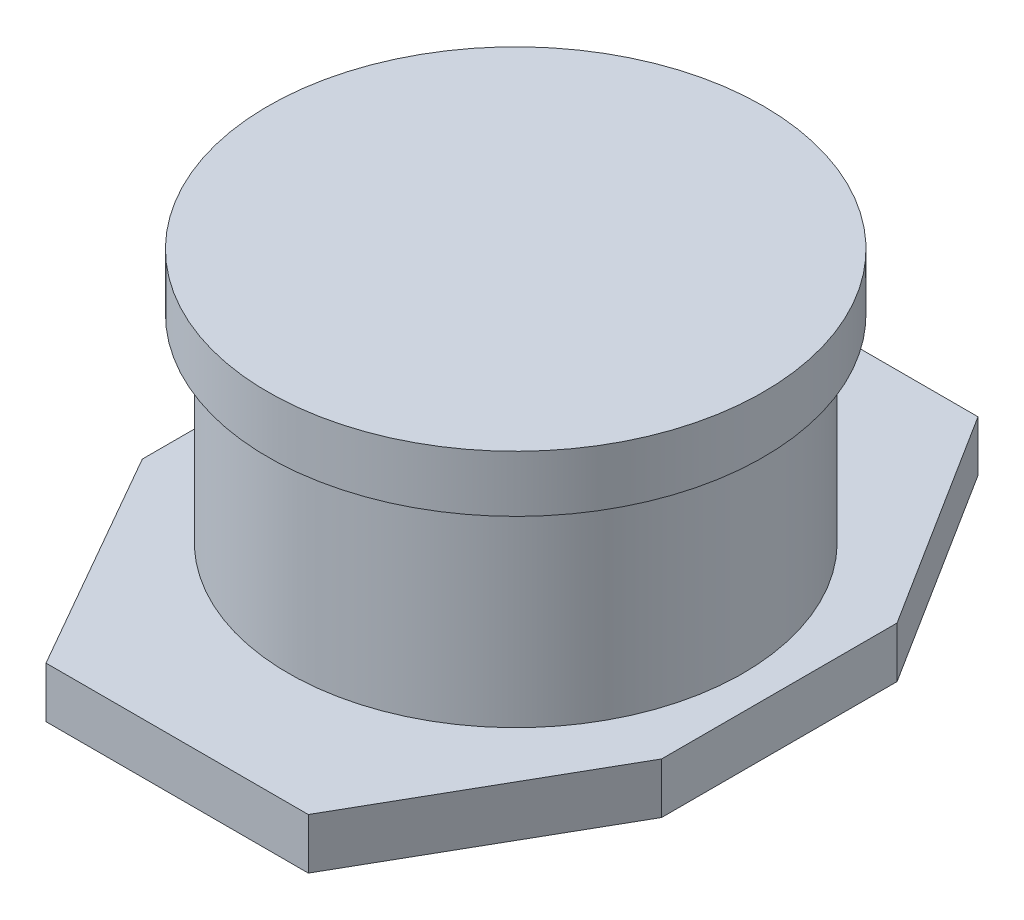
ISO-10303-21;
HEADER;
FILE_DESCRIPTION(('STEP AP214'),'2;1');
FILE_NAME('part.step','',(''),(''),'','','');
FILE_SCHEMA(('AUTOMOTIVE_DESIGN { 1 0 10303 214 1 1 1 1 }'));
ENDSEC;
DATA;
#1=APPLICATION_CONTEXT('core data for automotive mechanical design processes');
#2=APPLICATION_PROTOCOL_DEFINITION('international standard','automotive_design',2000,#1);
#3=PRODUCT_CONTEXT('',#1,'mechanical');
#4=PRODUCT('Part','Part','',(#3));
#5=PRODUCT_RELATED_PRODUCT_CATEGORY('part','',(#4));
#6=PRODUCT_DEFINITION_FORMATION('','',#4);
#7=PRODUCT_DEFINITION_CONTEXT('part definition',#1,'design');
#8=PRODUCT_DEFINITION('design','',#6,#7);
#9=PRODUCT_DEFINITION_SHAPE('','',#8);
#10=(LENGTH_UNIT() NAMED_UNIT(*) SI_UNIT(.MILLI.,.METRE.));
#11=(NAMED_UNIT(*) PLANE_ANGLE_UNIT() SI_UNIT($,.RADIAN.));
#12=(NAMED_UNIT(*) SI_UNIT($,.STERADIAN.) SOLID_ANGLE_UNIT());
#13=UNCERTAINTY_MEASURE_WITH_UNIT(LENGTH_MEASURE(1.E-05),#10,'distance_accuracy_value','');
#14=(GEOMETRIC_REPRESENTATION_CONTEXT(3) GLOBAL_UNCERTAINTY_ASSIGNED_CONTEXT((#13)) GLOBAL_UNIT_ASSIGNED_CONTEXT((#10,
#11,#12)) REPRESENTATION_CONTEXT('',''));
#15=CARTESIAN_POINT('',(0.,0.,0.));
#16=DIRECTION('',(0.,0.,1.));
#17=DIRECTION('',(1.,0.,0.));
#18=AXIS2_PLACEMENT_3D('',#15,#16,#17);
#19=CARTESIAN_POINT('',(-2.30220000927827,5.4,0.522935680184341));
#20=DIRECTION('',(0.,1.,0.));
#21=DIRECTION('',(0.,0.,1.));
#22=AXIS2_PLACEMENT_3D('',#19,#20,#21);
#23=PLANE('',#22);
#24=CARTESIAN_POINT('',(-0.019136169197603,5.4,0.522935680184341));
#25=DIRECTION('',(0.,-1.,0.));
#26=DIRECTION('',(0.,0.,-1.));
#27=AXIS2_PLACEMENT_3D('',#24,#25,#26);
#28=CIRCLE('',#27,4.39253848223317);
#29=CARTESIAN_POINT('',(-0.019136169197603,5.4,-3.86960280204883));
#30=VERTEX_POINT('',#29);
#31=EDGE_CURVE('E20',#30,#30,#28,.T.);
#32=ORIENTED_EDGE('',*,*,#31,.F.);
#33=EDGE_LOOP('',(#32));
#34=FACE_BOUND('',#33,.T.);
#35=ADVANCED_FACE('F17',(#34),#23,.T.);
#36=CARTESIAN_POINT('',(-0.019136169197603,5.4,0.522935680184341));
#37=DIRECTION('',(0.,-1.,0.));
#38=DIRECTION('',(0.,0.,-1.));
#39=AXIS2_PLACEMENT_3D('',#36,#37,#38);
#40=CYLINDRICAL_SURFACE('',#39,4.39253848223317);
#41=CARTESIAN_POINT('',(-0.019136169197603,4.4,0.522935680184341));
#42=DIRECTION('',(0.,-1.,0.));
#43=DIRECTION('',(0.,0.,-1.));
#44=AXIS2_PLACEMENT_3D('',#41,#42,#43);
#45=CIRCLE('',#44,4.39253848223317);
#46=CARTESIAN_POINT('',(-0.019136169197603,4.4,-3.86960280204883));
#47=VERTEX_POINT('',#46);
#48=EDGE_CURVE('E110',#47,#47,#45,.F.);
#49=ORIENTED_EDGE('',*,*,#48,.T.);
#50=EDGE_LOOP('',(#49));
#51=FACE_BOUND('',#50,.T.);
#52=ORIENTED_EDGE('',*,*,#31,.T.);
#53=EDGE_LOOP('',(#52));
#54=FACE_BOUND('',#53,.T.);
#55=ADVANCED_FACE('F117',(#51,#54),#40,.T.);
#56=CARTESIAN_POINT('',(-0.0191361691976033,4.4,0.522935680184341));
#57=DIRECTION('',(0.,1.,0.));
#58=DIRECTION('',(0.,0.,1.));
#59=AXIS2_PLACEMENT_3D('',#56,#57,#58);
#60=PLANE('',#59);
#61=CARTESIAN_POINT('',(-0.0191361691976022,4.4,0.522935680184341));
#62=DIRECTION('',(0.,-1.,0.));
#63=DIRECTION('',(0.,0.,-1.));
#64=AXIS2_PLACEMENT_3D('',#61,#62,#63);
#65=CIRCLE('',#64,4.03112893421778);
#66=CARTESIAN_POINT('',(-0.0191361691976022,4.4,-3.50819325403344));
#67=VERTEX_POINT('',#66);
#68=EDGE_CURVE('E108',#67,#67,#65,.T.);
#69=ORIENTED_EDGE('',*,*,#68,.F.);
#70=EDGE_LOOP('',(#69));
#71=FACE_BOUND('',#70,.T.);
#72=ORIENTED_EDGE('',*,*,#48,.F.);
#73=EDGE_LOOP('',(#72));
#74=FACE_BOUND('',#73,.T.);
#75=ADVANCED_FACE('F124',(#71,#74),#60,.F.);
#76=CARTESIAN_POINT('',(-0.0191361691976022,4.4,0.522935680184341));
#77=DIRECTION('',(0.,-1.,0.));
#78=DIRECTION('',(0.,0.,-1.));
#79=AXIS2_PLACEMENT_3D('',#76,#77,#78);
#80=CYLINDRICAL_SURFACE('',#79,4.03112893421778);
#81=CARTESIAN_POINT('',(-0.0191361691976022,0.9,0.522935680184341));
#82=DIRECTION('',(0.,-1.,0.));
#83=DIRECTION('',(0.,0.,-1.));
#84=AXIS2_PLACEMENT_3D('',#81,#82,#83);
#85=CIRCLE('',#84,4.03112893421778);
#86=CARTESIAN_POINT('',(-0.0191361691976022,0.9,-3.50819325403344));
#87=VERTEX_POINT('',#86);
#88=EDGE_CURVE('E91',#87,#87,#85,.T.);
#89=ORIENTED_EDGE('',*,*,#88,.F.);
#90=EDGE_LOOP('',(#89));
#91=FACE_BOUND('',#90,.T.);
#92=ORIENTED_EDGE('',*,*,#68,.T.);
#93=EDGE_LOOP('',(#92));
#94=FACE_BOUND('',#93,.T.);
#95=ADVANCED_FACE('F162',(#91,#94),#80,.T.);
#96=CARTESIAN_POINT('',(0.,0.9,0.522935680184341));
#97=DIRECTION('',(0.,1.,0.));
#98=DIRECTION('',(0.,0.,1.));
#99=AXIS2_PLACEMENT_3D('',#96,#97,#98);
#100=PLANE('',#99);
#101=ORIENTED_EDGE('',*,*,#88,.T.);
#102=EDGE_LOOP('',(#101));
#103=FACE_BOUND('',#102,.T.);
#104=DIRECTION('',(-0.496276882885727,0.,0.868164302141724));
#105=VECTOR('',#104,1.);
#106=CARTESIAN_POINT('',(4.60440001855655,0.9,2.5593405117462));
#107=LINE('',#106,#105);
#108=CARTESIAN_POINT('',(2.32554204331554,0.9,6.54587144232507));
#109=VERTEX_POINT('',#108);
#110=CARTESIAN_POINT('',(4.60440001855655,0.9,2.5593405117462));
#111=VERTEX_POINT('',#110);
#112=EDGE_CURVE('E82',#109,#111,#107,.F.);
#113=ORIENTED_EDGE('',*,*,#112,.T.);
#114=DIRECTION('',(0.,0.,1.));
#115=VECTOR('',#114,1.);
#116=CARTESIAN_POINT('',(4.60440001855655,0.9,-1.61582712654262));
#117=LINE('',#116,#115);
#118=CARTESIAN_POINT('',(4.60440001855655,0.9,-1.61582712654262));
#119=VERTEX_POINT('',#118);
#120=EDGE_CURVE('E79',#111,#119,#117,.F.);
#121=ORIENTED_EDGE('',*,*,#120,.T.);
#122=DIRECTION('',(0.533383785827167,0.,0.845873357552228));
#123=VECTOR('',#122,1.);
#124=CARTESIAN_POINT('',(2.15515054489858,0.9,-5.50000008195639));
#125=LINE('',#124,#123);
#126=CARTESIAN_POINT('',(2.15515054489858,0.9,-5.50000008195639));
#127=VERTEX_POINT('',#126);
#128=EDGE_CURVE('E293',#119,#127,#125,.F.);
#129=ORIENTED_EDGE('',*,*,#128,.T.);
#130=DIRECTION('',(-1.,0.,0.));
#131=VECTOR('',#130,1.);
#132=CARTESIAN_POINT('',(0.,0.9,-5.50000008195639));
#133=LINE('',#132,#131);
#134=CARTESIAN_POINT('',(-2.15515054489857,0.9,-5.50000008195639));
#135=VERTEX_POINT('',#134);
#136=EDGE_CURVE('E322',#135,#127,#133,.F.);
#137=ORIENTED_EDGE('',*,*,#136,.F.);
#138=DIRECTION('',(-0.533383785827167,0.,0.845873357552228));
#139=VECTOR('',#138,1.);
#140=CARTESIAN_POINT('',(-2.15515054489858,0.9,-5.50000008195639));
#141=LINE('',#140,#139);
#142=CARTESIAN_POINT('',(-4.60440001855654,0.9,-1.61582712654262));
#143=VERTEX_POINT('',#142);
#144=EDGE_CURVE('E318',#143,#135,#141,.F.);
#145=ORIENTED_EDGE('',*,*,#144,.F.);
#146=DIRECTION('',(0.,0.,1.));
#147=VECTOR('',#146,1.);
#148=CARTESIAN_POINT('',(-4.60440001855655,0.9,-1.61582712654262));
#149=LINE('',#148,#147);
#150=CARTESIAN_POINT('',(-4.60440001855654,0.9,2.5593405117462));
#151=VERTEX_POINT('',#150);
#152=EDGE_CURVE('E314',#151,#143,#149,.F.);
#153=ORIENTED_EDGE('',*,*,#152,.F.);
#154=DIRECTION('',(0.496276882885727,0.,0.868164302141724));
#155=VECTOR('',#154,1.);
#156=CARTESIAN_POINT('',(-4.60440001855655,0.9,2.5593405117462));
#157=LINE('',#156,#155);
#158=CARTESIAN_POINT('',(-2.32554204331553,0.9,6.54587144232507));
#159=VERTEX_POINT('',#158);
#160=EDGE_CURVE('E310',#159,#151,#157,.F.);
#161=ORIENTED_EDGE('',*,*,#160,.F.);
#162=DIRECTION('',(1.,0.,0.));
#163=VECTOR('',#162,1.);
#164=CARTESIAN_POINT('',(-2.32554204331553,0.9,6.54587144232507));
#165=LINE('',#164,#163);
#166=EDGE_CURVE('E85',#109,#159,#165,.F.);
#167=ORIENTED_EDGE('',*,*,#166,.F.);
#168=EDGE_LOOP('',(#113,#121,#129,#137,#145,#153,#161,#167));
#169=FACE_BOUND('',#168,.T.);
#170=ADVANCED_FACE('F83',(#103,#169),#100,.T.);
#171=CARTESIAN_POINT('',(4.60440001855655,0.,2.5593405117462));
#172=DIRECTION('',(-0.868164302141724,0.,-0.496276882885727));
#173=DIRECTION('',(-0.496276882885727,0.,0.868164302141724));
#174=AXIS2_PLACEMENT_3D('',#171,#172,#173);
#175=PLANE('',#174);
#176=DIRECTION('',(0.,1.,0.));
#177=VECTOR('',#176,1.);
#178=CARTESIAN_POINT('',(2.32554204331553,0.,6.54587144232507));
#179=LINE('',#178,#177);
#180=CARTESIAN_POINT('',(2.32554204331553,0.,6.54587144232507));
#181=VERTEX_POINT('',#180);
#182=EDGE_CURVE('E301',#181,#109,#179,.T.);
#183=ORIENTED_EDGE('',*,*,#182,.F.);
#184=DIRECTION('',(0.496276882885728,0.,-0.868164302141723));
#185=VECTOR('',#184,1.);
#186=CARTESIAN_POINT('',(2.32554204331553,0.,6.54587144232507));
#187=LINE('',#186,#185);
#188=CARTESIAN_POINT('',(4.60440001855655,0.,2.5593405117462));
#189=VERTEX_POINT('',#188);
#190=EDGE_CURVE('E102',#181,#189,#187,.T.);
#191=ORIENTED_EDGE('',*,*,#190,.T.);
#192=DIRECTION('',(0.,1.,0.));
#193=VECTOR('',#192,1.);
#194=CARTESIAN_POINT('',(4.60440001855655,0.,2.5593405117462));
#195=LINE('',#194,#193);
#196=EDGE_CURVE('E90',#189,#111,#195,.T.);
#197=ORIENTED_EDGE('',*,*,#196,.T.);
#198=ORIENTED_EDGE('',*,*,#112,.F.);
#199=EDGE_LOOP('',(#183,#191,#197,#198));
#200=FACE_BOUND('',#199,.T.);
#201=ADVANCED_FACE('F101',(#200),#175,.F.);
#202=CARTESIAN_POINT('',(4.60440001855655,0.,-1.61582712654262));
#203=DIRECTION('',(-1.,0.,0.));
#204=DIRECTION('',(0.,0.,1.));
#205=AXIS2_PLACEMENT_3D('',#202,#203,#204);
#206=PLANE('',#205);
#207=ORIENTED_EDGE('',*,*,#196,.F.);
#208=DIRECTION('',(0.,0.,1.));
#209=VECTOR('',#208,1.);
#210=CARTESIAN_POINT('',(4.60440001855655,0.,0.522935680184341));
#211=LINE('',#210,#209);
#212=CARTESIAN_POINT('',(4.60440001855655,0.,-1.61582712654262));
#213=VERTEX_POINT('',#212);
#214=EDGE_CURVE('E295',#189,#213,#211,.F.);
#215=ORIENTED_EDGE('',*,*,#214,.T.);
#216=DIRECTION('',(0.,1.,0.));
#217=VECTOR('',#216,1.);
#218=CARTESIAN_POINT('',(4.60440001855655,0.,-1.61582712654262));
#219=LINE('',#218,#217);
#220=EDGE_CURVE('E98',#213,#119,#219,.T.);
#221=ORIENTED_EDGE('',*,*,#220,.T.);
#222=ORIENTED_EDGE('',*,*,#120,.F.);
#223=EDGE_LOOP('',(#207,#215,#221,#222));
#224=FACE_BOUND('',#223,.T.);
#225=ADVANCED_FACE('F95',(#224),#206,.F.);
#226=CARTESIAN_POINT('',(2.15515054489858,0.,-5.50000008195639));
#227=DIRECTION('',(-0.845873357552228,0.,0.533383785827167));
#228=DIRECTION('',(0.533383785827167,0.,0.845873357552228));
#229=AXIS2_PLACEMENT_3D('',#226,#227,#228);
#230=PLANE('',#229);
#231=ORIENTED_EDGE('',*,*,#220,.F.);
#232=DIRECTION('',(-0.533383785827167,0.,-0.845873357552228));
#233=VECTOR('',#232,1.);
#234=CARTESIAN_POINT('',(4.60440001855655,0.,-1.61582712654262));
#235=LINE('',#234,#233);
#236=CARTESIAN_POINT('',(2.15515054489858,0.,-5.50000008195639));
#237=VERTEX_POINT('',#236);
#238=EDGE_CURVE('E292',#213,#237,#235,.T.);
#239=ORIENTED_EDGE('',*,*,#238,.T.);
#240=DIRECTION('',(0.,1.,0.));
#241=VECTOR('',#240,1.);
#242=CARTESIAN_POINT('',(2.15515054489858,0.,-5.50000008195639));
#243=LINE('',#242,#241);
#244=EDGE_CURVE('E320',#127,#237,#243,.F.);
#245=ORIENTED_EDGE('',*,*,#244,.F.);
#246=ORIENTED_EDGE('',*,*,#128,.F.);
#247=EDGE_LOOP('',(#231,#239,#245,#246));
#248=FACE_BOUND('',#247,.T.);
#249=ADVANCED_FACE('F151',(#248),#230,.F.);
#250=CARTESIAN_POINT('',(0.,0.,-5.50000008195639));
#251=DIRECTION('',(0.,0.,-1.));
#252=DIRECTION('',(-1.,0.,0.));
#253=AXIS2_PLACEMENT_3D('',#250,#251,#252);
#254=PLANE('',#253);
#255=DIRECTION('',(1.,0.,0.));
#256=VECTOR('',#255,1.);
#257=CARTESIAN_POINT('',(-2.30220000927827,0.,-5.50000008195639));
#258=LINE('',#257,#256);
#259=CARTESIAN_POINT('',(-2.15515054489858,0.,-5.50000008195639));
#260=VERTEX_POINT('',#259);
#261=EDGE_CURVE('E298',#237,#260,#258,.F.);
#262=ORIENTED_EDGE('',*,*,#261,.T.);
#263=DIRECTION('',(0.,1.,0.));
#264=VECTOR('',#263,1.);
#265=CARTESIAN_POINT('',(-2.15515054489858,0.,-5.50000008195639));
#266=LINE('',#265,#264);
#267=EDGE_CURVE('E316',#135,#260,#266,.F.);
#268=ORIENTED_EDGE('',*,*,#267,.F.);
#269=ORIENTED_EDGE('',*,*,#136,.T.);
#270=ORIENTED_EDGE('',*,*,#244,.T.);
#271=EDGE_LOOP('',(#262,#268,#269,#270));
#272=FACE_BOUND('',#271,.T.);
#273=ADVANCED_FACE('F147',(#272),#254,.T.);
#274=CARTESIAN_POINT('',(-2.15515054489858,0.,-5.50000008195639));
#275=DIRECTION('',(-0.845873357552228,0.,-0.533383785827167));
#276=DIRECTION('',(-0.533383785827167,0.,0.845873357552228));
#277=AXIS2_PLACEMENT_3D('',#274,#275,#276);
#278=PLANE('',#277);
#279=DIRECTION('',(-0.533383785827167,0.,0.845873357552228));
#280=VECTOR('',#279,1.);
#281=CARTESIAN_POINT('',(-2.15515054489858,0.,-5.50000008195639));
#282=LINE('',#281,#280);
#283=CARTESIAN_POINT('',(-4.60440001855655,0.,-1.61582712654262));
#284=VERTEX_POINT('',#283);
#285=EDGE_CURVE('E329',#260,#284,#282,.T.);
#286=ORIENTED_EDGE('',*,*,#285,.T.);
#287=DIRECTION('',(0.,1.,0.));
#288=VECTOR('',#287,1.);
#289=CARTESIAN_POINT('',(-4.60440001855655,0.,-1.61582712654262));
#290=LINE('',#289,#288);
#291=EDGE_CURVE('E312',#143,#284,#290,.F.);
#292=ORIENTED_EDGE('',*,*,#291,.F.);
#293=ORIENTED_EDGE('',*,*,#144,.T.);
#294=ORIENTED_EDGE('',*,*,#267,.T.);
#295=EDGE_LOOP('',(#286,#292,#293,#294));
#296=FACE_BOUND('',#295,.T.);
#297=ADVANCED_FACE('F143',(#296),#278,.T.);
#298=CARTESIAN_POINT('',(-4.60440001855655,0.,-1.61582712654262));
#299=DIRECTION('',(-1.,0.,0.));
#300=DIRECTION('',(0.,0.,1.));
#301=AXIS2_PLACEMENT_3D('',#298,#299,#300);
#302=PLANE('',#301);
#303=DIRECTION('',(0.,0.,1.));
#304=VECTOR('',#303,1.);
#305=CARTESIAN_POINT('',(-4.60440001855655,0.,0.522935680184341));
#306=LINE('',#305,#304);
#307=CARTESIAN_POINT('',(-4.60440001855655,0.,2.5593405117462));
#308=VERTEX_POINT('',#307);
#309=EDGE_CURVE('E332',#284,#308,#306,.T.);
#310=ORIENTED_EDGE('',*,*,#309,.T.);
#311=DIRECTION('',(0.,1.,0.));
#312=VECTOR('',#311,1.);
#313=CARTESIAN_POINT('',(-4.60440001855655,0.,2.5593405117462));
#314=LINE('',#313,#312);
#315=EDGE_CURVE('E308',#151,#308,#314,.F.);
#316=ORIENTED_EDGE('',*,*,#315,.F.);
#317=ORIENTED_EDGE('',*,*,#152,.T.);
#318=ORIENTED_EDGE('',*,*,#291,.T.);
#319=EDGE_LOOP('',(#310,#316,#317,#318));
#320=FACE_BOUND('',#319,.T.);
#321=ADVANCED_FACE('F139',(#320),#302,.T.);
#322=CARTESIAN_POINT('',(-4.60440001855655,0.,2.5593405117462));
#323=DIRECTION('',(-0.868164302141724,0.,0.496276882885727));
#324=DIRECTION('',(0.496276882885727,0.,0.868164302141724));
#325=AXIS2_PLACEMENT_3D('',#322,#323,#324);
#326=PLANE('',#325);
#327=DIRECTION('',(0.496276882885728,0.,0.868164302141723));
#328=VECTOR('',#327,1.);
#329=CARTESIAN_POINT('',(-4.60440001855655,0.,2.5593405117462));
#330=LINE('',#329,#328);
#331=CARTESIAN_POINT('',(-2.32554204331553,0.,6.54587144232507));
#332=VERTEX_POINT('',#331);
#333=EDGE_CURVE('E26',#308,#332,#330,.T.);
#334=ORIENTED_EDGE('',*,*,#333,.T.);
#335=DIRECTION('',(0.,1.,0.));
#336=VECTOR('',#335,1.);
#337=CARTESIAN_POINT('',(-2.32554204331553,0.,6.54587144232507));
#338=LINE('',#337,#336);
#339=EDGE_CURVE('E34',#159,#332,#338,.F.);
#340=ORIENTED_EDGE('',*,*,#339,.F.);
#341=ORIENTED_EDGE('',*,*,#160,.T.);
#342=ORIENTED_EDGE('',*,*,#315,.T.);
#343=EDGE_LOOP('',(#334,#340,#341,#342));
#344=FACE_BOUND('',#343,.T.);
#345=ADVANCED_FACE('F133',(#344),#326,.T.);
#346=CARTESIAN_POINT('',(-2.32554204331553,0.,6.54587144232507));
#347=DIRECTION('',(0.,0.,1.));
#348=DIRECTION('',(1.,0.,0.));
#349=AXIS2_PLACEMENT_3D('',#346,#347,#348);
#350=PLANE('',#349);
#351=DIRECTION('',(1.,0.,0.));
#352=VECTOR('',#351,1.);
#353=CARTESIAN_POINT('',(-2.30220000927827,0.,6.54587144232507));
#354=LINE('',#353,#352);
#355=EDGE_CURVE('E11',#332,#181,#354,.T.);
#356=ORIENTED_EDGE('',*,*,#355,.T.);
#357=ORIENTED_EDGE('',*,*,#182,.T.);
#358=ORIENTED_EDGE('',*,*,#166,.T.);
#359=ORIENTED_EDGE('',*,*,#339,.T.);
#360=EDGE_LOOP('',(#356,#357,#358,#359));
#361=FACE_BOUND('',#360,.T.);
#362=ADVANCED_FACE('F127',(#361),#350,.T.);
#363=CARTESIAN_POINT('',(-2.30220000927827,0.,0.522935680184341));
#364=DIRECTION('',(0.,1.,0.));
#365=DIRECTION('',(0.,0.,1.));
#366=AXIS2_PLACEMENT_3D('',#363,#364,#365);
#367=PLANE('',#366);
#368=ORIENTED_EDGE('',*,*,#333,.F.);
#369=ORIENTED_EDGE('',*,*,#309,.F.);
#370=ORIENTED_EDGE('',*,*,#285,.F.);
#371=ORIENTED_EDGE('',*,*,#261,.F.);
#372=ORIENTED_EDGE('',*,*,#238,.F.);
#373=ORIENTED_EDGE('',*,*,#214,.F.);
#374=ORIENTED_EDGE('',*,*,#190,.F.);
#375=ORIENTED_EDGE('',*,*,#355,.F.);
#376=EDGE_LOOP('',(#368,#369,#370,#371,#372,#373,#374,#375));
#377=FACE_BOUND('',#376,.T.);
#378=ADVANCED_FACE('F125',(#377),#367,.F.);
#379=CLOSED_SHELL('',(#35,#55,#75,#95,#170,#201,#225,#249,#273,#297,#321,#345,#362,#378));
#380=MANIFOLD_SOLID_BREP('B1',#379);
#381=ADVANCED_BREP_SHAPE_REPRESENTATION('',(#18,#380),#14);
#382=SHAPE_DEFINITION_REPRESENTATION(#9,#381);
ENDSEC;
END-ISO-10303-21;
